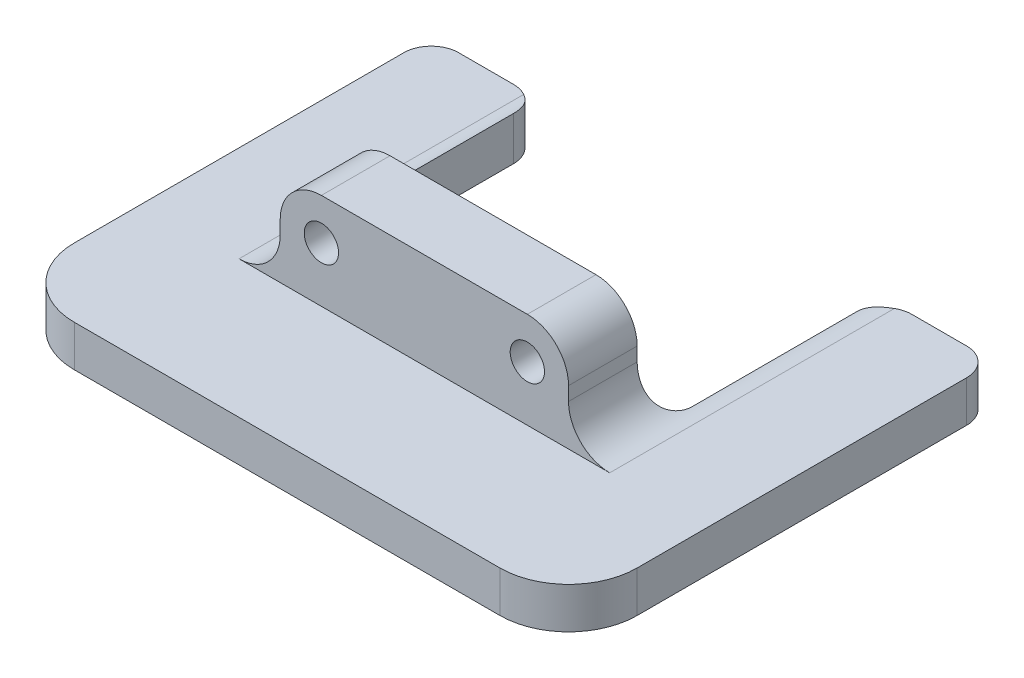
ISO-10303-21;
HEADER;
FILE_DESCRIPTION(('STEP AP214'),'2;1');
FILE_NAME('part.step','',(''),(''),'','','');
FILE_SCHEMA(('AUTOMOTIVE_DESIGN { 1 0 10303 214 1 1 1 1 }'));
ENDSEC;
DATA;
#1=APPLICATION_CONTEXT('core data for automotive mechanical design processes');
#2=APPLICATION_PROTOCOL_DEFINITION('international standard','automotive_design',2000,#1);
#3=PRODUCT_CONTEXT('',#1,'mechanical');
#4=PRODUCT('Part','Part','',(#3));
#5=PRODUCT_RELATED_PRODUCT_CATEGORY('part','',(#4));
#6=PRODUCT_DEFINITION_FORMATION('','',#4);
#7=PRODUCT_DEFINITION_CONTEXT('part definition',#1,'design');
#8=PRODUCT_DEFINITION('design','',#6,#7);
#9=PRODUCT_DEFINITION_SHAPE('','',#8);
#10=(LENGTH_UNIT() NAMED_UNIT(*) SI_UNIT(.MILLI.,.METRE.));
#11=(NAMED_UNIT(*) PLANE_ANGLE_UNIT() SI_UNIT($,.RADIAN.));
#12=(NAMED_UNIT(*) SI_UNIT($,.STERADIAN.) SOLID_ANGLE_UNIT());
#13=UNCERTAINTY_MEASURE_WITH_UNIT(LENGTH_MEASURE(1.E-05),#10,'distance_accuracy_value','');
#14=(GEOMETRIC_REPRESENTATION_CONTEXT(3) GLOBAL_UNCERTAINTY_ASSIGNED_CONTEXT((#13)) GLOBAL_UNIT_ASSIGNED_CONTEXT((#10,
#11,#12)) REPRESENTATION_CONTEXT('',''));
#15=CARTESIAN_POINT('',(0.,0.,0.));
#16=DIRECTION('',(0.,0.,1.));
#17=DIRECTION('',(1.,0.,0.));
#18=AXIS2_PLACEMENT_3D('',#15,#16,#17);
#19=CARTESIAN_POINT('',(15.,0.,0.));
#20=DIRECTION('',(0.,0.,-1.));
#21=DIRECTION('',(-1.,0.,0.));
#22=AXIS2_PLACEMENT_3D('',#19,#20,#21);
#23=PLANE('',#22);
#24=DIRECTION('',(0.,1.,0.));
#25=VECTOR('',#24,1.);
#26=CARTESIAN_POINT('',(18.,-4.,0.));
#27=LINE('',#26,#25);
#28=CARTESIAN_POINT('',(18.,-1.,0.));
#29=VERTEX_POINT('',#28);
#30=CARTESIAN_POINT('',(18.,0.,0.));
#31=VERTEX_POINT('',#30);
#32=EDGE_CURVE('E209',#29,#31,#27,.T.);
#33=ORIENTED_EDGE('',*,*,#32,.F.);
#34=DIRECTION('',(0.,1.,0.));
#35=VECTOR('',#34,1.);
#36=CARTESIAN_POINT('',(18.,-7.,0.));
#37=LINE('',#36,#35);
#38=CARTESIAN_POINT('',(18.,-7.,0.));
#39=VERTEX_POINT('',#38);
#40=EDGE_CURVE('E359',#29,#39,#37,.F.);
#41=ORIENTED_EDGE('',*,*,#40,.T.);
#42=DIRECTION('',(1.,0.,0.));
#43=VECTOR('',#42,1.);
#44=CARTESIAN_POINT('',(-13.,-7.,0.));
#45=LINE('',#44,#43);
#46=CARTESIAN_POINT('',(-3.,-7.,0.));
#47=VERTEX_POINT('',#46);
#48=EDGE_CURVE('E345',#47,#39,#45,.T.);
#49=ORIENTED_EDGE('',*,*,#48,.F.);
#50=DIRECTION('',(0.,1.,0.));
#51=VECTOR('',#50,1.);
#52=CARTESIAN_POINT('',(-3.,-3.82842712474625,0.));
#53=LINE('',#52,#51);
#54=CARTESIAN_POINT('',(-3.,-1.,0.));
#55=VERTEX_POINT('',#54);
#56=EDGE_CURVE('E357',#47,#55,#53,.T.);
#57=ORIENTED_EDGE('',*,*,#56,.T.);
#58=DIRECTION('',(0.,-1.,0.));
#59=VECTOR('',#58,1.);
#60=CARTESIAN_POINT('',(-3.,-4.,0.));
#61=LINE('',#60,#59);
#62=CARTESIAN_POINT('',(-3.,0.,0.));
#63=VERTEX_POINT('',#62);
#64=EDGE_CURVE('E447',#63,#55,#61,.T.);
#65=ORIENTED_EDGE('',*,*,#64,.F.);
#66=CARTESIAN_POINT('',(0.,0.,0.));
#67=DIRECTION('',(0.,0.,1.));
#68=DIRECTION('',(-1.,0.,0.));
#69=AXIS2_PLACEMENT_3D('',#66,#67,#68);
#70=CIRCLE('',#69,3.);
#71=CARTESIAN_POINT('',(0.,3.,0.));
#72=VERTEX_POINT('',#71);
#73=EDGE_CURVE('E445',#72,#63,#70,.T.);
#74=ORIENTED_EDGE('',*,*,#73,.F.);
#75=DIRECTION('',(-1.,0.,0.));
#76=VECTOR('',#75,1.);
#77=CARTESIAN_POINT('',(0.,3.,0.));
#78=LINE('',#77,#76);
#79=CARTESIAN_POINT('',(15.,3.,0.));
#80=VERTEX_POINT('',#79);
#81=EDGE_CURVE('E443',#80,#72,#78,.T.);
#82=ORIENTED_EDGE('',*,*,#81,.F.);
#83=CARTESIAN_POINT('',(15.,0.,0.));
#84=DIRECTION('',(0.,0.,1.));
#85=DIRECTION('',(-1.,0.,0.));
#86=AXIS2_PLACEMENT_3D('',#83,#84,#85);
#87=CIRCLE('',#86,3.);
#88=EDGE_CURVE('E213',#31,#80,#87,.T.);
#89=ORIENTED_EDGE('',*,*,#88,.F.);
#90=EDGE_LOOP('',(#33,#41,#49,#57,#65,#74,#82,#89));
#91=FACE_BOUND('',#90,.T.);
#92=CARTESIAN_POINT('',(0.,0.,0.));
#93=DIRECTION('',(0.,0.,1.));
#94=DIRECTION('',(1.,0.,0.));
#95=AXIS2_PLACEMENT_3D('',#92,#93,#94);
#96=CIRCLE('',#95,1.25);
#97=CARTESIAN_POINT('',(1.25,0.,0.));
#98=VERTEX_POINT('',#97);
#99=EDGE_CURVE('E425',#98,#98,#96,.T.);
#100=ORIENTED_EDGE('',*,*,#99,.T.);
#101=EDGE_LOOP('',(#100));
#102=FACE_BOUND('',#101,.T.);
#103=CARTESIAN_POINT('',(15.,0.,0.));
#104=DIRECTION('',(0.,0.,1.));
#105=DIRECTION('',(1.,0.,0.));
#106=AXIS2_PLACEMENT_3D('',#103,#104,#105);
#107=CIRCLE('',#106,1.25);
#108=CARTESIAN_POINT('',(16.25,0.,0.));
#109=VERTEX_POINT('',#108);
#110=EDGE_CURVE('E416',#109,#109,#107,.T.);
#111=ORIENTED_EDGE('',*,*,#110,.T.);
#112=EDGE_LOOP('',(#111));
#113=FACE_BOUND('',#112,.T.);
#114=ADVANCED_FACE('F33',(#91,#102,#113),#23,.T.);
#115=CARTESIAN_POINT('',(15.,0.,5.));
#116=DIRECTION('',(0.,0.,-1.));
#117=DIRECTION('',(-1.,0.,0.));
#118=AXIS2_PLACEMENT_3D('',#115,#116,#117);
#119=PLANE('',#118);
#120=CARTESIAN_POINT('',(15.,0.,5.));
#121=DIRECTION('',(0.,0.,1.));
#122=DIRECTION('',(-1.,0.,0.));
#123=AXIS2_PLACEMENT_3D('',#120,#121,#122);
#124=CIRCLE('',#123,3.);
#125=CARTESIAN_POINT('',(18.,0.,5.));
#126=VERTEX_POINT('',#125);
#127=CARTESIAN_POINT('',(15.,3.,5.));
#128=VERTEX_POINT('',#127);
#129=EDGE_CURVE('E199',#126,#128,#124,.T.);
#130=ORIENTED_EDGE('',*,*,#129,.T.);
#131=DIRECTION('',(-1.,0.,0.));
#132=VECTOR('',#131,1.);
#133=CARTESIAN_POINT('',(0.,3.,5.));
#134=LINE('',#133,#132);
#135=CARTESIAN_POINT('',(0.,3.,5.));
#136=VERTEX_POINT('',#135);
#137=EDGE_CURVE('E188',#128,#136,#134,.T.);
#138=ORIENTED_EDGE('',*,*,#137,.T.);
#139=CARTESIAN_POINT('',(0.,0.,5.));
#140=DIRECTION('',(0.,0.,1.));
#141=DIRECTION('',(-1.,0.,0.));
#142=AXIS2_PLACEMENT_3D('',#139,#140,#141);
#143=CIRCLE('',#142,3.);
#144=CARTESIAN_POINT('',(-3.,0.,5.));
#145=VERTEX_POINT('',#144);
#146=EDGE_CURVE('E198',#136,#145,#143,.T.);
#147=ORIENTED_EDGE('',*,*,#146,.T.);
#148=DIRECTION('',(0.,-1.,0.));
#149=VECTOR('',#148,1.);
#150=CARTESIAN_POINT('',(-3.,-4.,5.));
#151=LINE('',#150,#149);
#152=CARTESIAN_POINT('',(-3.,-1.,5.));
#153=VERTEX_POINT('',#152);
#154=EDGE_CURVE('E434',#145,#153,#151,.T.);
#155=ORIENTED_EDGE('',*,*,#154,.T.);
#156=CARTESIAN_POINT('',(-6.,-1.,5.));
#157=DIRECTION('',(0.,0.,-1.));
#158=DIRECTION('',(-1.,0.,0.));
#159=AXIS2_PLACEMENT_3D('',#156,#157,#158);
#160=CIRCLE('',#159,3.);
#161=CARTESIAN_POINT('',(-6.,-4.,5.));
#162=VERTEX_POINT('',#161);
#163=EDGE_CURVE('E231',#153,#162,#160,.T.);
#164=ORIENTED_EDGE('',*,*,#163,.T.);
#165=DIRECTION('',(1.,0.,0.));
#166=VECTOR('',#165,1.);
#167=CARTESIAN_POINT('',(-3.,-4.,5.));
#168=LINE('',#167,#166);
#169=CARTESIAN_POINT('',(21.,-4.,5.));
#170=VERTEX_POINT('',#169);
#171=EDGE_CURVE('E437',#162,#170,#168,.T.);
#172=ORIENTED_EDGE('',*,*,#171,.T.);
#173=CARTESIAN_POINT('',(21.,-1.,5.));
#174=DIRECTION('',(0.,0.,-1.));
#175=DIRECTION('',(-1.,0.,0.));
#176=AXIS2_PLACEMENT_3D('',#173,#174,#175);
#177=CIRCLE('',#176,3.);
#178=CARTESIAN_POINT('',(18.,-1.,5.));
#179=VERTEX_POINT('',#178);
#180=EDGE_CURVE('E237',#170,#179,#177,.T.);
#181=ORIENTED_EDGE('',*,*,#180,.T.);
#182=DIRECTION('',(0.,1.,0.));
#183=VECTOR('',#182,1.);
#184=CARTESIAN_POINT('',(18.,-4.,5.));
#185=LINE('',#184,#183);
#186=EDGE_CURVE('E205',#179,#126,#185,.T.);
#187=ORIENTED_EDGE('',*,*,#186,.T.);
#188=EDGE_LOOP('',(#130,#138,#147,#155,#164,#172,#181,#187));
#189=FACE_BOUND('',#188,.T.);
#190=CARTESIAN_POINT('',(0.,0.,5.));
#191=DIRECTION('',(0.,0.,1.));
#192=DIRECTION('',(1.,0.,0.));
#193=AXIS2_PLACEMENT_3D('',#190,#191,#192);
#194=CIRCLE('',#193,1.25);
#195=CARTESIAN_POINT('',(1.25,0.,5.));
#196=VERTEX_POINT('',#195);
#197=EDGE_CURVE('E428',#196,#196,#194,.T.);
#198=ORIENTED_EDGE('',*,*,#197,.F.);
#199=EDGE_LOOP('',(#198));
#200=FACE_BOUND('',#199,.T.);
#201=CARTESIAN_POINT('',(15.,0.,5.));
#202=DIRECTION('',(0.,0.,1.));
#203=DIRECTION('',(1.,0.,0.));
#204=AXIS2_PLACEMENT_3D('',#201,#202,#203);
#205=CIRCLE('',#204,1.25);
#206=CARTESIAN_POINT('',(16.25,0.,5.));
#207=VERTEX_POINT('',#206);
#208=EDGE_CURVE('E422',#207,#207,#205,.T.);
#209=ORIENTED_EDGE('',*,*,#208,.F.);
#210=EDGE_LOOP('',(#209));
#211=FACE_BOUND('',#210,.T.);
#212=ADVANCED_FACE('F202',(#189,#200,#211),#119,.F.);
#213=CARTESIAN_POINT('',(15.,0.,5.));
#214=DIRECTION('',(0.,0.,-1.));
#215=DIRECTION('',(-1.,0.,0.));
#216=AXIS2_PLACEMENT_3D('',#213,#214,#215);
#217=CYLINDRICAL_SURFACE('',#216,3.);
#218=ORIENTED_EDGE('',*,*,#88,.T.);
#219=DIRECTION('',(0.,0.,-1.));
#220=VECTOR('',#219,1.);
#221=CARTESIAN_POINT('',(15.,3.,5.));
#222=LINE('',#221,#220);
#223=EDGE_CURVE('E192',#128,#80,#222,.T.);
#224=ORIENTED_EDGE('',*,*,#223,.F.);
#225=ORIENTED_EDGE('',*,*,#129,.F.);
#226=DIRECTION('',(0.,0.,-1.));
#227=VECTOR('',#226,1.);
#228=CARTESIAN_POINT('',(18.,0.,5.));
#229=LINE('',#228,#227);
#230=EDGE_CURVE('E441',#126,#31,#229,.T.);
#231=ORIENTED_EDGE('',*,*,#230,.T.);
#232=EDGE_LOOP('',(#218,#224,#225,#231));
#233=FACE_BOUND('',#232,.T.);
#234=ADVANCED_FACE('F211',(#233),#217,.T.);
#235=CARTESIAN_POINT('',(0.,3.,5.));
#236=DIRECTION('',(0.,-1.,0.));
#237=DIRECTION('',(0.,0.,-1.));
#238=AXIS2_PLACEMENT_3D('',#235,#236,#237);
#239=PLANE('',#238);
#240=ORIENTED_EDGE('',*,*,#81,.T.);
#241=DIRECTION('',(0.,0.,-1.));
#242=VECTOR('',#241,1.);
#243=CARTESIAN_POINT('',(0.,3.,5.));
#244=LINE('',#243,#242);
#245=EDGE_CURVE('E195',#136,#72,#244,.T.);
#246=ORIENTED_EDGE('',*,*,#245,.F.);
#247=ORIENTED_EDGE('',*,*,#137,.F.);
#248=ORIENTED_EDGE('',*,*,#223,.T.);
#249=EDGE_LOOP('',(#240,#246,#247,#248));
#250=FACE_BOUND('',#249,.T.);
#251=ADVANCED_FACE('F190',(#250),#239,.F.);
#252=CARTESIAN_POINT('',(0.,0.,5.));
#253=DIRECTION('',(0.,0.,-1.));
#254=DIRECTION('',(-1.,0.,0.));
#255=AXIS2_PLACEMENT_3D('',#252,#253,#254);
#256=CYLINDRICAL_SURFACE('',#255,3.);
#257=ORIENTED_EDGE('',*,*,#73,.T.);
#258=DIRECTION('',(0.,0.,-1.));
#259=VECTOR('',#258,1.);
#260=CARTESIAN_POINT('',(-3.,0.,5.));
#261=LINE('',#260,#259);
#262=EDGE_CURVE('E218',#145,#63,#261,.T.);
#263=ORIENTED_EDGE('',*,*,#262,.F.);
#264=ORIENTED_EDGE('',*,*,#146,.F.);
#265=ORIENTED_EDGE('',*,*,#245,.T.);
#266=EDGE_LOOP('',(#257,#263,#264,#265));
#267=FACE_BOUND('',#266,.T.);
#268=ADVANCED_FACE('F473',(#267),#256,.T.);
#269=CARTESIAN_POINT('',(-3.,-4.,5.));
#270=DIRECTION('',(1.,0.,0.));
#271=DIRECTION('',(0.,0.,-1.));
#272=AXIS2_PLACEMENT_3D('',#269,#270,#271);
#273=PLANE('',#272);
#274=ORIENTED_EDGE('',*,*,#64,.T.);
#275=DIRECTION('',(0.,0.,-1.));
#276=VECTOR('',#275,1.);
#277=CARTESIAN_POINT('',(-3.,-1.,5.));
#278=LINE('',#277,#276);
#279=EDGE_CURVE('E224',#55,#153,#278,.F.);
#280=ORIENTED_EDGE('',*,*,#279,.T.);
#281=ORIENTED_EDGE('',*,*,#154,.F.);
#282=ORIENTED_EDGE('',*,*,#262,.T.);
#283=EDGE_LOOP('',(#274,#280,#281,#282));
#284=FACE_BOUND('',#283,.T.);
#285=ADVANCED_FACE('F456',(#284),#273,.F.);
#286=CARTESIAN_POINT('',(18.,-4.,5.));
#287=DIRECTION('',(-1.,0.,0.));
#288=DIRECTION('',(0.,0.,1.));
#289=AXIS2_PLACEMENT_3D('',#286,#287,#288);
#290=PLANE('',#289);
#291=ORIENTED_EDGE('',*,*,#186,.F.);
#292=DIRECTION('',(0.,0.,-1.));
#293=VECTOR('',#292,1.);
#294=CARTESIAN_POINT('',(18.,-1.,5.));
#295=LINE('',#294,#293);
#296=EDGE_CURVE('E226',#179,#29,#295,.T.);
#297=ORIENTED_EDGE('',*,*,#296,.T.);
#298=ORIENTED_EDGE('',*,*,#32,.T.);
#299=ORIENTED_EDGE('',*,*,#230,.F.);
#300=EDGE_LOOP('',(#291,#297,#298,#299));
#301=FACE_BOUND('',#300,.T.);
#302=ADVANCED_FACE('F480',(#301),#290,.F.);
#303=CARTESIAN_POINT('',(0.,0.,5.));
#304=DIRECTION('',(0.,0.,-1.));
#305=DIRECTION('',(-1.,0.,0.));
#306=AXIS2_PLACEMENT_3D('',#303,#304,#305);
#307=CYLINDRICAL_SURFACE('',#306,1.25);
#308=ORIENTED_EDGE('',*,*,#197,.T.);
#309=EDGE_LOOP('',(#308));
#310=FACE_BOUND('',#309,.T.);
#311=ORIENTED_EDGE('',*,*,#99,.F.);
#312=EDGE_LOOP('',(#311));
#313=FACE_BOUND('',#312,.T.);
#314=ADVANCED_FACE('F492',(#310,#313),#307,.F.);
#315=CARTESIAN_POINT('',(15.,0.,5.));
#316=DIRECTION('',(0.,0.,-1.));
#317=DIRECTION('',(-1.,0.,0.));
#318=AXIS2_PLACEMENT_3D('',#315,#316,#317);
#319=CYLINDRICAL_SURFACE('',#318,1.25);
#320=ORIENTED_EDGE('',*,*,#208,.T.);
#321=EDGE_LOOP('',(#320));
#322=FACE_BOUND('',#321,.T.);
#323=ORIENTED_EDGE('',*,*,#110,.F.);
#324=EDGE_LOOP('',(#323));
#325=FACE_BOUND('',#324,.T.);
#326=ADVANCED_FACE('F497',(#322,#325),#319,.F.);
#327=CARTESIAN_POINT('',(0.,-4.,0.));
#328=DIRECTION('',(0.,1.,0.));
#329=DIRECTION('',(0.,0.,1.));
#330=AXIS2_PLACEMENT_3D('',#327,#328,#329);
#331=PLANE('',#330);
#332=DIRECTION('',(0.,0.,1.));
#333=VECTOR('',#332,1.);
#334=CARTESIAN_POINT('',(28.,-4.,0.));
#335=LINE('',#334,#333);
#336=CARTESIAN_POINT('',(28.,-4.,-14.));
#337=VERTEX_POINT('',#336);
#338=CARTESIAN_POINT('',(28.,-4.,10.));
#339=VERTEX_POINT('',#338);
#340=EDGE_CURVE('E418',#337,#339,#335,.T.);
#341=ORIENTED_EDGE('',*,*,#340,.F.);
#342=CARTESIAN_POINT('',(26.,-4.,-14.));
#343=DIRECTION('',(0.,1.,0.));
#344=DIRECTION('',(0.,0.,1.));
#345=AXIS2_PLACEMENT_3D('',#342,#343,#344);
#346=CIRCLE('',#345,2.);
#347=CARTESIAN_POINT('',(26.,-4.,-16.));
#348=VERTEX_POINT('',#347);
#349=EDGE_CURVE('E268',#337,#348,#346,.T.);
#350=ORIENTED_EDGE('',*,*,#349,.T.);
#351=DIRECTION('',(-1.,0.,0.));
#352=VECTOR('',#351,1.);
#353=CARTESIAN_POINT('',(28.,-4.,-16.));
#354=LINE('',#353,#352);
#355=CARTESIAN_POINT('',(22.,-4.,-16.));
#356=VERTEX_POINT('',#355);
#357=EDGE_CURVE('E355',#348,#356,#354,.T.);
#358=ORIENTED_EDGE('',*,*,#357,.T.);
#359=CARTESIAN_POINT('',(22.,-4.,-14.));
#360=DIRECTION('',(0.,1.,0.));
#361=DIRECTION('',(0.,0.,1.));
#362=AXIS2_PLACEMENT_3D('',#359,#360,#361);
#363=CIRCLE('',#362,2.);
#364=CARTESIAN_POINT('',(21.,-4.,-15.7320508075689));
#365=VERTEX_POINT('',#364);
#366=EDGE_CURVE('E266',#356,#365,#363,.T.);
#367=ORIENTED_EDGE('',*,*,#366,.T.);
#368=DIRECTION('',(0.,0.,-1.));
#369=VECTOR('',#368,1.);
#370=CARTESIAN_POINT('',(21.,-4.,0.));
#371=LINE('',#370,#369);
#372=EDGE_CURVE('E214',#365,#170,#371,.F.);
#373=ORIENTED_EDGE('',*,*,#372,.T.);
#374=ORIENTED_EDGE('',*,*,#171,.F.);
#375=DIRECTION('',(0.,0.,-1.));
#376=VECTOR('',#375,1.);
#377=CARTESIAN_POINT('',(-6.,-4.,0.));
#378=LINE('',#377,#376);
#379=CARTESIAN_POINT('',(-6.,-4.,-15.7320508075689));
#380=VERTEX_POINT('',#379);
#381=EDGE_CURVE('E216',#162,#380,#378,.T.);
#382=ORIENTED_EDGE('',*,*,#381,.T.);
#383=CARTESIAN_POINT('',(-7.,-4.,-14.));
#384=DIRECTION('',(0.,1.,0.));
#385=DIRECTION('',(0.,0.,1.));
#386=AXIS2_PLACEMENT_3D('',#383,#384,#385);
#387=CIRCLE('',#386,2.);
#388=CARTESIAN_POINT('',(-7.,-4.,-16.));
#389=VERTEX_POINT('',#388);
#390=EDGE_CURVE('E264',#380,#389,#387,.T.);
#391=ORIENTED_EDGE('',*,*,#390,.T.);
#392=DIRECTION('',(-1.,0.,0.));
#393=VECTOR('',#392,1.);
#394=CARTESIAN_POINT('',(-13.,-4.,-16.));
#395=LINE('',#394,#393);
#396=CARTESIAN_POINT('',(-11.,-4.,-16.));
#397=VERTEX_POINT('',#396);
#398=EDGE_CURVE('E399',#389,#397,#395,.T.);
#399=ORIENTED_EDGE('',*,*,#398,.T.);
#400=CARTESIAN_POINT('',(-11.,-4.,-14.));
#401=DIRECTION('',(0.,1.,0.));
#402=DIRECTION('',(0.,0.,1.));
#403=AXIS2_PLACEMENT_3D('',#400,#401,#402);
#404=CIRCLE('',#403,2.);
#405=CARTESIAN_POINT('',(-13.,-4.,-14.));
#406=VERTEX_POINT('',#405);
#407=EDGE_CURVE('E262',#397,#406,#404,.T.);
#408=ORIENTED_EDGE('',*,*,#407,.T.);
#409=DIRECTION('',(0.,0.,-1.));
#410=VECTOR('',#409,1.);
#411=CARTESIAN_POINT('',(-13.,-4.,0.));
#412=LINE('',#411,#410);
#413=CARTESIAN_POINT('',(-13.,-4.,10.));
#414=VERTEX_POINT('',#413);
#415=EDGE_CURVE('E389',#414,#406,#412,.T.);
#416=ORIENTED_EDGE('',*,*,#415,.F.);
#417=CARTESIAN_POINT('',(-8.,-4.,10.));
#418=DIRECTION('',(0.,1.,0.));
#419=DIRECTION('',(0.,0.,1.));
#420=AXIS2_PLACEMENT_3D('',#417,#418,#419);
#421=CIRCLE('',#420,5.);
#422=CARTESIAN_POINT('',(-8.,-4.,15.));
#423=VERTEX_POINT('',#422);
#424=EDGE_CURVE('E245',#414,#423,#421,.T.);
#425=ORIENTED_EDGE('',*,*,#424,.T.);
#426=DIRECTION('',(-1.,0.,0.));
#427=VECTOR('',#426,1.);
#428=CARTESIAN_POINT('',(-13.,-4.,15.));
#429=LINE('',#428,#427);
#430=CARTESIAN_POINT('',(23.,-4.,15.));
#431=VERTEX_POINT('',#430);
#432=EDGE_CURVE('E394',#431,#423,#429,.T.);
#433=ORIENTED_EDGE('',*,*,#432,.F.);
#434=CARTESIAN_POINT('',(23.,-4.,10.));
#435=DIRECTION('',(0.,1.,0.));
#436=DIRECTION('',(0.,0.,1.));
#437=AXIS2_PLACEMENT_3D('',#434,#435,#436);
#438=CIRCLE('',#437,5.);
#439=EDGE_CURVE('E242',#431,#339,#438,.T.);
#440=ORIENTED_EDGE('',*,*,#439,.T.);
#441=EDGE_LOOP('',(#341,#350,#358,#367,#373,#374,#382,#391,#399,#408,#416,#425,#433,#440));
#442=FACE_BOUND('',#441,.T.);
#443=ADVANCED_FACE('F403',(#442),#331,.T.);
#444=CARTESIAN_POINT('',(-13.,-7.,0.));
#445=DIRECTION('',(1.,0.,0.));
#446=DIRECTION('',(0.,0.,-1.));
#447=AXIS2_PLACEMENT_3D('',#444,#445,#446);
#448=PLANE('',#447);
#449=ORIENTED_EDGE('',*,*,#415,.T.);
#450=DIRECTION('',(0.,1.,0.));
#451=VECTOR('',#450,1.);
#452=CARTESIAN_POINT('',(-13.,-7.,-14.));
#453=LINE('',#452,#451);
#454=CARTESIAN_POINT('',(-13.,-7.,-14.));
#455=VERTEX_POINT('',#454);
#456=EDGE_CURVE('E318',#406,#455,#453,.F.);
#457=ORIENTED_EDGE('',*,*,#456,.T.);
#458=DIRECTION('',(0.,0.,-1.));
#459=VECTOR('',#458,1.);
#460=CARTESIAN_POINT('',(-13.,-7.,0.));
#461=LINE('',#460,#459);
#462=CARTESIAN_POINT('',(-13.,-7.,10.));
#463=VERTEX_POINT('',#462);
#464=EDGE_CURVE('E386',#463,#455,#461,.T.);
#465=ORIENTED_EDGE('',*,*,#464,.F.);
#466=DIRECTION('',(0.,1.,0.));
#467=VECTOR('',#466,1.);
#468=CARTESIAN_POINT('',(-13.,-7.,10.));
#469=LINE('',#468,#467);
#470=EDGE_CURVE('E239',#463,#414,#469,.T.);
#471=ORIENTED_EDGE('',*,*,#470,.T.);
#472=EDGE_LOOP('',(#449,#457,#465,#471));
#473=FACE_BOUND('',#472,.T.);
#474=ADVANCED_FACE('F385',(#473),#448,.F.);
#475=CARTESIAN_POINT('',(28.,-7.,0.));
#476=DIRECTION('',(-1.,0.,0.));
#477=DIRECTION('',(0.,0.,1.));
#478=AXIS2_PLACEMENT_3D('',#475,#476,#477);
#479=PLANE('',#478);
#480=DIRECTION('',(0.,0.,1.));
#481=VECTOR('',#480,1.);
#482=CARTESIAN_POINT('',(28.,-7.,0.));
#483=LINE('',#482,#481);
#484=CARTESIAN_POINT('',(28.,-7.,-14.));
#485=VERTEX_POINT('',#484);
#486=CARTESIAN_POINT('',(28.,-7.,10.));
#487=VERTEX_POINT('',#486);
#488=EDGE_CURVE('E412',#485,#487,#483,.T.);
#489=ORIENTED_EDGE('',*,*,#488,.F.);
#490=DIRECTION('',(0.,1.,0.));
#491=VECTOR('',#490,1.);
#492=CARTESIAN_POINT('',(28.,-4.,-14.));
#493=LINE('',#492,#491);
#494=EDGE_CURVE('E259',#485,#337,#493,.T.);
#495=ORIENTED_EDGE('',*,*,#494,.T.);
#496=ORIENTED_EDGE('',*,*,#340,.T.);
#497=DIRECTION('',(0.,1.,0.));
#498=VECTOR('',#497,1.);
#499=CARTESIAN_POINT('',(28.,-7.,10.));
#500=LINE('',#499,#498);
#501=EDGE_CURVE('E256',#339,#487,#500,.F.);
#502=ORIENTED_EDGE('',*,*,#501,.T.);
#503=EDGE_LOOP('',(#489,#495,#496,#502));
#504=FACE_BOUND('',#503,.T.);
#505=ADVANCED_FACE('F515',(#504),#479,.F.);
#506=CARTESIAN_POINT('',(-13.,-7.,15.));
#507=DIRECTION('',(0.,0.,-1.));
#508=DIRECTION('',(-1.,0.,0.));
#509=AXIS2_PLACEMENT_3D('',#506,#507,#508);
#510=PLANE('',#509);
#511=ORIENTED_EDGE('',*,*,#432,.T.);
#512=DIRECTION('',(0.,1.,0.));
#513=VECTOR('',#512,1.);
#514=CARTESIAN_POINT('',(-8.,-7.,15.));
#515=LINE('',#514,#513);
#516=CARTESIAN_POINT('',(-8.,-7.,15.));
#517=VERTEX_POINT('',#516);
#518=EDGE_CURVE('E250',#423,#517,#515,.F.);
#519=ORIENTED_EDGE('',*,*,#518,.T.);
#520=DIRECTION('',(-1.,0.,0.));
#521=VECTOR('',#520,1.);
#522=CARTESIAN_POINT('',(-13.,-7.,15.));
#523=LINE('',#522,#521);
#524=CARTESIAN_POINT('',(23.,-7.,15.));
#525=VERTEX_POINT('',#524);
#526=EDGE_CURVE('E414',#525,#517,#523,.T.);
#527=ORIENTED_EDGE('',*,*,#526,.F.);
#528=DIRECTION('',(0.,1.,0.));
#529=VECTOR('',#528,1.);
#530=CARTESIAN_POINT('',(23.,-7.,15.));
#531=LINE('',#530,#529);
#532=EDGE_CURVE('E247',#525,#431,#531,.T.);
#533=ORIENTED_EDGE('',*,*,#532,.T.);
#534=EDGE_LOOP('',(#511,#519,#527,#533));
#535=FACE_BOUND('',#534,.T.);
#536=ADVANCED_FACE('F523',(#535),#510,.F.);
#537=CARTESIAN_POINT('',(0.,-7.,0.));
#538=DIRECTION('',(0.,1.,0.));
#539=DIRECTION('',(0.,0.,1.));
#540=AXIS2_PLACEMENT_3D('',#537,#538,#539);
#541=PLANE('',#540);
#542=DIRECTION('',(1.,0.,0.));
#543=VECTOR('',#542,1.);
#544=CARTESIAN_POINT('',(28.,-7.,-16.));
#545=LINE('',#544,#543);
#546=CARTESIAN_POINT('',(22.,-7.,-16.));
#547=VERTEX_POINT('',#546);
#548=CARTESIAN_POINT('',(26.,-7.,-16.));
#549=VERTEX_POINT('',#548);
#550=EDGE_CURVE('E354',#547,#549,#545,.T.);
#551=ORIENTED_EDGE('',*,*,#550,.T.);
#552=CARTESIAN_POINT('',(26.,-7.,-14.));
#553=DIRECTION('',(0.,1.,0.));
#554=DIRECTION('',(0.,0.,1.));
#555=AXIS2_PLACEMENT_3D('',#552,#553,#554);
#556=CIRCLE('',#555,2.);
#557=EDGE_CURVE('E281',#549,#485,#556,.F.);
#558=ORIENTED_EDGE('',*,*,#557,.T.);
#559=ORIENTED_EDGE('',*,*,#488,.T.);
#560=CARTESIAN_POINT('',(23.,-7.,10.));
#561=DIRECTION('',(0.,1.,0.));
#562=DIRECTION('',(0.,0.,1.));
#563=AXIS2_PLACEMENT_3D('',#560,#561,#562);
#564=CIRCLE('',#563,5.);
#565=EDGE_CURVE('E252',#487,#525,#564,.F.);
#566=ORIENTED_EDGE('',*,*,#565,.T.);
#567=ORIENTED_EDGE('',*,*,#526,.T.);
#568=CARTESIAN_POINT('',(-8.,-7.,10.));
#569=DIRECTION('',(0.,1.,0.));
#570=DIRECTION('',(0.,0.,1.));
#571=AXIS2_PLACEMENT_3D('',#568,#569,#570);
#572=CIRCLE('',#571,5.);
#573=EDGE_CURVE('E254',#517,#463,#572,.F.);
#574=ORIENTED_EDGE('',*,*,#573,.T.);
#575=ORIENTED_EDGE('',*,*,#464,.T.);
#576=CARTESIAN_POINT('',(-11.,-7.,-14.));
#577=DIRECTION('',(0.,1.,0.));
#578=DIRECTION('',(0.,0.,1.));
#579=AXIS2_PLACEMENT_3D('',#576,#577,#578);
#580=CIRCLE('',#579,2.);
#581=CARTESIAN_POINT('',(-11.,-7.,-16.));
#582=VERTEX_POINT('',#581);
#583=EDGE_CURVE('E275',#455,#582,#580,.F.);
#584=ORIENTED_EDGE('',*,*,#583,.T.);
#585=DIRECTION('',(1.,0.,0.));
#586=VECTOR('',#585,1.);
#587=CARTESIAN_POINT('',(-13.,-7.,-16.));
#588=LINE('',#587,#586);
#589=CARTESIAN_POINT('',(-7.,-7.,-16.));
#590=VERTEX_POINT('',#589);
#591=EDGE_CURVE('E400',#582,#590,#588,.T.);
#592=ORIENTED_EDGE('',*,*,#591,.T.);
#593=CARTESIAN_POINT('',(-7.,-7.,-14.));
#594=DIRECTION('',(0.,1.,0.));
#595=DIRECTION('',(0.,0.,1.));
#596=AXIS2_PLACEMENT_3D('',#593,#594,#595);
#597=CIRCLE('',#596,2.);
#598=CARTESIAN_POINT('',(-5.,-7.,-14.));
#599=VERTEX_POINT('',#598);
#600=EDGE_CURVE('E277',#590,#599,#597,.F.);
#601=ORIENTED_EDGE('',*,*,#600,.T.);
#602=DIRECTION('',(0.,0.,1.));
#603=VECTOR('',#602,1.);
#604=CARTESIAN_POINT('',(-5.,-7.,0.));
#605=LINE('',#604,#603);
#606=CARTESIAN_POINT('',(-5.,-7.,-2.));
#607=VERTEX_POINT('',#606);
#608=EDGE_CURVE('E404',#599,#607,#605,.T.);
#609=ORIENTED_EDGE('',*,*,#608,.T.);
#610=CARTESIAN_POINT('',(-3.,-7.,-2.));
#611=DIRECTION('',(0.,1.,0.));
#612=DIRECTION('',(0.,0.,1.));
#613=AXIS2_PLACEMENT_3D('',#610,#611,#612);
#614=CIRCLE('',#613,2.);
#615=EDGE_CURVE('E11',#607,#47,#614,.T.);
#616=ORIENTED_EDGE('',*,*,#615,.T.);
#617=ORIENTED_EDGE('',*,*,#48,.T.);
#618=CARTESIAN_POINT('',(18.,-7.,-2.));
#619=DIRECTION('',(0.,1.,0.));
#620=DIRECTION('',(0.,0.,1.));
#621=AXIS2_PLACEMENT_3D('',#618,#619,#620);
#622=CIRCLE('',#621,2.);
#623=CARTESIAN_POINT('',(20.,-7.,-2.));
#624=VERTEX_POINT('',#623);
#625=EDGE_CURVE('E317',#39,#624,#622,.T.);
#626=ORIENTED_EDGE('',*,*,#625,.T.);
#627=DIRECTION('',(0.,0.,-1.));
#628=VECTOR('',#627,1.);
#629=CARTESIAN_POINT('',(20.,-7.,0.));
#630=LINE('',#629,#628);
#631=CARTESIAN_POINT('',(20.,-7.,-14.));
#632=VERTEX_POINT('',#631);
#633=EDGE_CURVE('E342',#624,#632,#630,.T.);
#634=ORIENTED_EDGE('',*,*,#633,.T.);
#635=CARTESIAN_POINT('',(22.,-7.,-14.));
#636=DIRECTION('',(0.,1.,0.));
#637=DIRECTION('',(0.,0.,1.));
#638=AXIS2_PLACEMENT_3D('',#635,#636,#637);
#639=CIRCLE('',#638,2.);
#640=EDGE_CURVE('E279',#632,#547,#639,.F.);
#641=ORIENTED_EDGE('',*,*,#640,.T.);
#642=EDGE_LOOP('',(#551,#558,#559,#566,#567,#574,#575,#584,#592,#601,#609,#616,#617,#626,#634,#641));
#643=FACE_BOUND('',#642,.T.);
#644=ADVANCED_FACE('F341',(#643),#541,.F.);
#645=CARTESIAN_POINT('',(-13.,-24.8885438199983,-16.));
#646=DIRECTION('',(0.,0.,-1.));
#647=DIRECTION('',(-1.,0.,0.));
#648=AXIS2_PLACEMENT_3D('',#645,#646,#647);
#649=PLANE('',#648);
#650=ORIENTED_EDGE('',*,*,#398,.F.);
#651=DIRECTION('',(0.,1.,0.));
#652=VECTOR('',#651,1.);
#653=CARTESIAN_POINT('',(-7.,-24.8885438199983,-16.));
#654=LINE('',#653,#652);
#655=EDGE_CURVE('E374',#389,#590,#654,.F.);
#656=ORIENTED_EDGE('',*,*,#655,.T.);
#657=ORIENTED_EDGE('',*,*,#591,.F.);
#658=DIRECTION('',(0.,1.,0.));
#659=VECTOR('',#658,1.);
#660=CARTESIAN_POINT('',(-11.,-4.,-16.));
#661=LINE('',#660,#659);
#662=EDGE_CURVE('E372',#582,#397,#661,.T.);
#663=ORIENTED_EDGE('',*,*,#662,.T.);
#664=EDGE_LOOP('',(#650,#656,#657,#663));
#665=FACE_BOUND('',#664,.T.);
#666=ADVANCED_FACE('F398',(#665),#649,.T.);
#667=CARTESIAN_POINT('',(-5.,-24.8885438199983,0.));
#668=DIRECTION('',(1.,0.,0.));
#669=DIRECTION('',(0.,0.,-1.));
#670=AXIS2_PLACEMENT_3D('',#667,#668,#669);
#671=PLANE('',#670);
#672=DIRECTION('',(0.,0.,-1.));
#673=VECTOR('',#672,1.);
#674=CARTESIAN_POINT('',(-5.,-3.82842712474625,-16.));
#675=LINE('',#674,#673);
#676=CARTESIAN_POINT('',(-5.,-3.82842712474625,-14.));
#677=VERTEX_POINT('',#676);
#678=CARTESIAN_POINT('',(-5.,-3.82842712474625,-2.));
#679=VERTEX_POINT('',#678);
#680=EDGE_CURVE('E229',#677,#679,#675,.F.);
#681=ORIENTED_EDGE('',*,*,#680,.T.);
#682=DIRECTION('',(0.,1.,0.));
#683=VECTOR('',#682,1.);
#684=CARTESIAN_POINT('',(-5.,-7.,-2.));
#685=LINE('',#684,#683);
#686=EDGE_CURVE('E365',#679,#607,#685,.F.);
#687=ORIENTED_EDGE('',*,*,#686,.T.);
#688=ORIENTED_EDGE('',*,*,#608,.F.);
#689=DIRECTION('',(0.,1.,0.));
#690=VECTOR('',#689,1.);
#691=CARTESIAN_POINT('',(-5.,-24.8885438199983,-14.));
#692=LINE('',#691,#690);
#693=EDGE_CURVE('E363',#599,#677,#692,.T.);
#694=ORIENTED_EDGE('',*,*,#693,.T.);
#695=EDGE_LOOP('',(#681,#687,#688,#694));
#696=FACE_BOUND('',#695,.T.);
#697=ADVANCED_FACE('F467',(#696),#671,.T.);
#698=CARTESIAN_POINT('',(20.,-24.8885438199983,0.));
#699=DIRECTION('',(-1.,0.,0.));
#700=DIRECTION('',(0.,0.,1.));
#701=AXIS2_PLACEMENT_3D('',#698,#699,#700);
#702=PLANE('',#701);
#703=DIRECTION('',(0.,0.,-1.));
#704=VECTOR('',#703,1.);
#705=CARTESIAN_POINT('',(20.,-3.82842712474624,0.));
#706=LINE('',#705,#704);
#707=CARTESIAN_POINT('',(20.,-3.82842712474624,-2.));
#708=VERTEX_POINT('',#707);
#709=CARTESIAN_POINT('',(20.,-3.82842712474624,-14.));
#710=VERTEX_POINT('',#709);
#711=EDGE_CURVE('E234',#708,#710,#706,.T.);
#712=ORIENTED_EDGE('',*,*,#711,.T.);
#713=DIRECTION('',(0.,1.,0.));
#714=VECTOR('',#713,1.);
#715=CARTESIAN_POINT('',(20.,-24.8885438199983,-14.));
#716=LINE('',#715,#714);
#717=EDGE_CURVE('E353',#710,#632,#716,.F.);
#718=ORIENTED_EDGE('',*,*,#717,.T.);
#719=ORIENTED_EDGE('',*,*,#633,.F.);
#720=DIRECTION('',(0.,1.,0.));
#721=VECTOR('',#720,1.);
#722=CARTESIAN_POINT('',(20.,-3.82842712474624,-2.));
#723=LINE('',#722,#721);
#724=EDGE_CURVE('E291',#624,#708,#723,.T.);
#725=ORIENTED_EDGE('',*,*,#724,.T.);
#726=EDGE_LOOP('',(#712,#718,#719,#725));
#727=FACE_BOUND('',#726,.T.);
#728=ADVANCED_FACE('F350',(#727),#702,.T.);
#729=CARTESIAN_POINT('',(28.,-24.8885438199983,-16.));
#730=DIRECTION('',(0.,0.,-1.));
#731=DIRECTION('',(-1.,0.,0.));
#732=AXIS2_PLACEMENT_3D('',#729,#730,#731);
#733=PLANE('',#732);
#734=ORIENTED_EDGE('',*,*,#357,.F.);
#735=DIRECTION('',(0.,1.,0.));
#736=VECTOR('',#735,1.);
#737=CARTESIAN_POINT('',(26.,-7.,-16.));
#738=LINE('',#737,#736);
#739=EDGE_CURVE('E273',#348,#549,#738,.F.);
#740=ORIENTED_EDGE('',*,*,#739,.T.);
#741=ORIENTED_EDGE('',*,*,#550,.F.);
#742=DIRECTION('',(0.,1.,0.));
#743=VECTOR('',#742,1.);
#744=CARTESIAN_POINT('',(22.,-24.8885438199983,-16.));
#745=LINE('',#744,#743);
#746=EDGE_CURVE('E270',#547,#356,#745,.T.);
#747=ORIENTED_EDGE('',*,*,#746,.T.);
#748=EDGE_LOOP('',(#734,#740,#741,#747));
#749=FACE_BOUND('',#748,.T.);
#750=ADVANCED_FACE('F507',(#749),#733,.T.);
#751=CARTESIAN_POINT('',(-6.,-1.,0.));
#752=DIRECTION('',(0.,0.,-1.));
#753=DIRECTION('',(-1.,0.,0.));
#754=AXIS2_PLACEMENT_3D('',#751,#752,#753);
#755=CYLINDRICAL_SURFACE('',#754,3.);
#756=ORIENTED_EDGE('',*,*,#680,.F.);
#757=CARTESIAN_POINT('',(-5.,-3.82842712474625,-14.));
#758=CARTESIAN_POINT('',(-4.99999265806744,-3.82841182400506,-14.0550781443512));
#759=CARTESIAN_POINT('',(-5.00227500591609,-3.82923117584639,-14.1101500412768));
#760=CARTESIAN_POINT('',(-5.01136111584483,-3.83242569745194,-14.2198545591851));
#761=CARTESIAN_POINT('',(-5.01816321990644,-3.83480029668771,-14.2744873338191));
#762=CARTESIAN_POINT('',(-5.0361980138943,-3.84098069178117,-14.3827301025215));
#763=CARTESIAN_POINT('',(-5.04741445783428,-3.84478123739696,-14.4363430996268));
#764=CARTESIAN_POINT('',(-5.07416707223557,-3.85359959007776,-14.5423653209714));
#765=CARTESIAN_POINT('',(-5.08970350307169,-3.85861747051181,-14.5947744724462));
#766=CARTESIAN_POINT('',(-5.14257832660738,-3.87510102498306,-14.7495615693944));
#767=CARTESIAN_POINT('',(-5.18621778846857,-3.88801038075264,-14.8497100001151));
#768=CARTESIAN_POINT('',(-5.28914341782373,-3.91504713179848,-15.0415650897109));
#769=CARTESIAN_POINT('',(-5.34845525174275,-3.9291764992807,-15.1332575650193));
#770=CARTESIAN_POINT('',(-5.48385826583204,-3.95610303069603,-15.309236919));
#771=CARTESIAN_POINT('',(-5.5604977473639,-3.968829884862,-15.3931142625969));
#772=CARTESIAN_POINT('',(-5.72713103404349,-3.98873065956576,-15.5467909753149));
#773=CARTESIAN_POINT('',(-5.81708101677128,-3.9959223392079,-15.6166348321069));
#774=CARTESIAN_POINT('',(-5.9410464530328,-3.99956180739713,-15.6970011035699));
#775=CARTESIAN_POINT('',(-5.97030509276333,-4.00000476420336,-15.7149153152082));
#776=CARTESIAN_POINT('',(-6.,-4.,-15.7320508075689));
#777=B_SPLINE_CURVE_WITH_KNOTS('',3,(#757,#758,#759,#760,#761,#762,#763,#764,#765,#766,#767,
#768,#769,#770,#771,#772,#773,#774,#775,#776),.UNSPECIFIED.,.F.,.F.,(4,2,2,2,2,2,2,2,2,4),(0.,
0.165170648534212,0.330280739618907,0.49478877858866,0.659306734958521,0.987707896978204,
1.31665024663155,1.65799423936293,1.99823844213363,2.1011137942272),.UNSPECIFIED.);
#778=EDGE_CURVE('E55',#677,#380,#777,.T.);
#779=ORIENTED_EDGE('',*,*,#778,.T.);
#780=ORIENTED_EDGE('',*,*,#381,.F.);
#781=ORIENTED_EDGE('',*,*,#163,.F.);
#782=ORIENTED_EDGE('',*,*,#279,.F.);
#783=CARTESIAN_POINT('',(-3.,-1.,0.));
#784=CARTESIAN_POINT('',(-2.99999081844046,-1.08468057991087,-4.08070034306521E-05));
#785=CARTESIAN_POINT('',(-3.00358502848274,-1.16935984299454,-1.27835970598177E-06));
#786=CARTESIAN_POINT('',(-3.01791476964296,-1.338119549342,-5.65012641626756E-05));
#787=CARTESIAN_POINT('',(-3.02865092870103,-1.42219993929414,-0.000151264620500521));
#788=CARTESIAN_POINT('',(-3.05729332648929,-1.58970174068187,-0.000772162532402998));
#789=CARTESIAN_POINT('',(-3.07524643651899,-1.67311513617932,-0.00130114101613216));
#790=CARTESIAN_POINT('',(-3.11818494576128,-1.83809659216666,-0.00337855864146647));
#791=CARTESIAN_POINT('',(-3.14316995402086,-1.91966475497379,-0.00492694111359556));
#792=CARTESIAN_POINT('',(-3.19972713561523,-2.07963192891732,-0.0097974506784253));
#793=CARTESIAN_POINT('',(-3.23123972487629,-2.15805243336397,-0.0131039303784691));
#794=CARTESIAN_POINT('',(-3.30069623124199,-2.31182116914053,-0.0224233251806503));
#795=CARTESIAN_POINT('',(-3.33863919680813,-2.38716985298129,-0.0284358400733516));
#796=CARTESIAN_POINT('',(-3.42039578430527,-2.53383781854975,-0.0442411613398568));
#797=CARTESIAN_POINT('',(-3.46418631950306,-2.60517145311518,-0.0540193727209806));
#798=CARTESIAN_POINT('',(-3.55709797012513,-2.74331923223528,-0.0785553331548114));
#799=CARTESIAN_POINT('',(-3.60621609811189,-2.81013587590906,-0.09331030119415));
#800=CARTESIAN_POINT('',(-3.72644449064535,-2.96036847402638,-0.135170718817197));
#801=CARTESIAN_POINT('',(-3.79935240550658,-3.04170009515619,-0.164769986464137));
#802=CARTESIAN_POINT('',(-3.94991970666177,-3.19283794734629,-0.238002315579784));
#803=CARTESIAN_POINT('',(-4.02757553149147,-3.26265267545136,-0.281624960041121));
#804=CARTESIAN_POINT('',(-4.18356921035068,-3.38972050895516,-0.385082520904076));
#805=CARTESIAN_POINT('',(-4.26190821091273,-3.44688878069924,-0.445021245125527));
#806=CARTESIAN_POINT('',(-4.41315020340085,-3.54758450888201,-0.581081902238124));
#807=CARTESIAN_POINT('',(-4.48605436171465,-3.59111489864708,-0.657200349166925));
#808=CARTESIAN_POINT('',(-4.61396154827047,-3.66151793977056,-0.814949901252832));
#809=CARTESIAN_POINT('',(-4.67004207472746,-3.68966458158605,-0.895149014407888));
#810=CARTESIAN_POINT('',(-4.77068058062243,-3.73713000522794,-1.06489323914979));
#811=CARTESIAN_POINT('',(-4.81523378555883,-3.75644513166184,-1.15444220186677));
#812=CARTESIAN_POINT('',(-4.89062757014722,-3.7876443203711,-1.34003742436189));
#813=CARTESIAN_POINT('',(-4.92150208152069,-3.7995468007756,-1.43606691796425));
#814=CARTESIAN_POINT('',(-4.96845166141496,-3.81718754983315,-1.63212841162731));
#815=CARTESIAN_POINT('',(-4.98454876903728,-3.82293500027123,-1.73215421828837));
#816=CARTESIAN_POINT('',(-4.99533244902172,-3.82677253231539,-1.86059558286367));
#817=CARTESIAN_POINT('',(-4.99708359824896,-3.82739424707241,-1.88846715741564));
#818=CARTESIAN_POINT('',(-4.99941577902837,-3.82822112635189,-1.94422253892553));
#819=CARTESIAN_POINT('',(-4.99999860329149,-3.82842692906555,-1.97210626137568));
#820=CARTESIAN_POINT('',(-5.,-3.82842712474619,-2.));
#821=B_SPLINE_CURVE_WITH_KNOTS('',3,(#783,#784,#785,#786,#787,#788,#789,#790,#791,#792,#793,
#794,#795,#796,#797,#798,#799,#800,#801,#802,#803,#804,#805,#806,#807,#808,#809,#810,#811,#812,
#813,#814,#815,#816,#817,#818,#819,#820),.UNSPECIFIED.,.F.,.F.,(4,2,2,2,2,2,2,2,2,2,2,2,2,2,2,2,
2,2,4),(0.,0.253963590261567,0.507949512664211,0.763612336281237,1.0192609485991,
1.27267141765619,1.52604442084744,1.77844513285816,2.03070503628705,2.36876911822807,
2.7065826535299,3.04659783092807,3.38653982531267,3.69056771212811,3.99472132339932,
4.29811616010172,4.60105777345976,4.68484074777505,4.76849506441024),.UNSPECIFIED.);
#822=EDGE_CURVE('E41',#55,#679,#821,.T.);
#823=ORIENTED_EDGE('',*,*,#822,.T.);
#824=EDGE_LOOP('',(#756,#779,#780,#781,#782,#823));
#825=FACE_BOUND('',#824,.T.);
#826=ADVANCED_FACE('F303',(#825),#755,.F.);
#827=CARTESIAN_POINT('',(21.,-1.,5.));
#828=DIRECTION('',(0.,0.,-1.));
#829=DIRECTION('',(-1.,0.,0.));
#830=AXIS2_PLACEMENT_3D('',#827,#828,#829);
#831=CYLINDRICAL_SURFACE('',#830,3.);
#832=ORIENTED_EDGE('',*,*,#372,.F.);
#833=CARTESIAN_POINT('',(21.,-4.,-15.7320508075689));
#834=CARTESIAN_POINT('',(20.9523414448146,-4.00000326087516,-15.7045380746525));
#835=CARTESIAN_POINT('',(20.9058562742383,-3.99886399104074,-15.6750731064375));
#836=CARTESIAN_POINT('',(20.8155535615913,-3.99466481328935,-15.6124832604689));
#837=CARTESIAN_POINT('',(20.7717342727433,-3.99160617820372,-15.579360820162));
#838=CARTESIAN_POINT('',(20.6449980847357,-3.98012484554497,-15.4750903721172));
#839=CARTESIAN_POINT('',(20.5664219047201,-3.96939095787028,-15.3988182442151));
#840=CARTESIAN_POINT('',(20.4231201340441,-3.94491159144625,-15.2350273871356));
#841=CARTESIAN_POINT('',(20.3583676496828,-3.93117206756554,-15.1475310355719));
#842=CARTESIAN_POINT('',(20.2437891234135,-3.90372590330973,-14.963075842983));
#843=CARTESIAN_POINT('',(20.1939822789344,-3.89001932747095,-14.8661050422063));
#844=CARTESIAN_POINT('',(20.1088900707715,-3.86495782183999,-14.6607443625401));
#845=CARTESIAN_POINT('',(20.0743140953613,-3.85372801866045,-14.5520439448012));
#846=CARTESIAN_POINT('',(20.0241747138616,-3.83698854109847,-14.3301186003911));
#847=CARTESIAN_POINT('',(20.0085593830288,-3.83146325085057,-14.2169069114068));
#848=CARTESIAN_POINT('',(20.0008845477729,-3.82873500983035,-14.0688707973808));
#849=CARTESIAN_POINT('',(19.9999923099531,-3.82841548870569,-14.0344270988954));
#850=CARTESIAN_POINT('',(20.,-3.82842712474623,-14.));
#851=B_SPLINE_CURVE_WITH_KNOTS('',3,(#833,#834,#835,#836,#837,#838,#839,#840,#841,#842,#843,
#844,#845,#846,#847,#848,#849,#850),.UNSPECIFIED.,.F.,.F.,(4,2,2,2,2,2,2,2,4),(0.,
0.164959535623883,0.329809793400568,0.658207232196769,0.985959838227589,1.314131652528,
1.65629033145296,1.99750986167365,2.10082468853949),.UNSPECIFIED.);
#852=EDGE_CURVE('E283',#365,#710,#851,.T.);
#853=ORIENTED_EDGE('',*,*,#852,.T.);
#854=ORIENTED_EDGE('',*,*,#711,.F.);
#855=CARTESIAN_POINT('',(20.,-3.82842712474624,-2.));
#856=CARTESIAN_POINT('',(20.0000062549477,-3.82841883159369,-1.94776670031488));
#857=CARTESIAN_POINT('',(19.9979537904565,-3.82770339697815,-1.89553482490736));
#858=CARTESIAN_POINT('',(19.9897784451226,-3.82479856674602,-1.79142904833881));
#859=CARTESIAN_POINT('',(19.9836553408299,-3.82260909021461,-1.73955516698713));
#860=CARTESIAN_POINT('',(19.9673795881845,-3.81669424729348,-1.63648730953953));
#861=CARTESIAN_POINT('',(19.9572238920513,-3.81296771913737,-1.58529387803257));
#862=CARTESIAN_POINT('',(19.9329948932204,-3.80386619567858,-1.48400864029209));
#863=CARTESIAN_POINT('',(19.9189217230762,-3.7984912561517,-1.4339167968466));
#864=CARTESIAN_POINT('',(19.8709745390262,-3.779658877106,-1.28571110417774));
#865=CARTESIAN_POINT('',(19.8313781710168,-3.76349557769522,-1.18970032571394));
#866=CARTESIAN_POINT('',(19.7388285450568,-3.72249609569527,-1.00651920066198));
#867=CARTESIAN_POINT('',(19.685888458311,-3.69766845619051,-0.919340254693921));
#868=CARTESIAN_POINT('',(19.5707259260031,-3.6384198299955,-0.758060353660886));
#869=CARTESIAN_POINT('',(19.5087335128758,-3.60422209530026,-0.683713720216297));
#870=CARTESIAN_POINT('',(19.3782102103922,-3.52499622912358,-0.547612240038171));
#871=CARTESIAN_POINT('',(19.3096795990031,-3.47996855794615,-0.48585685834564));
#872=CARTESIAN_POINT('',(19.1716794129466,-3.37998714014158,-0.376809790076924));
#873=CARTESIAN_POINT('',(19.1022618536933,-3.32526807410112,-0.329235226792285));
#874=CARTESIAN_POINT('',(18.9647526956805,-3.20591559558049,-0.246228182653852));
#875=CARTESIAN_POINT('',(18.896661487988,-3.14127930747435,-0.210799233245097));
#876=CARTESIAN_POINT('',(18.7595971936423,-2.99779886629087,-0.14820614633027));
#877=CARTESIAN_POINT('',(18.6909828252078,-2.91823431071669,-0.121920847328399));
#878=CARTESIAN_POINT('',(18.5614721585319,-2.75066420926279,-0.0792166223168573));
#879=CARTESIAN_POINT('',(18.5005804083939,-2.66265374240914,-0.0628034892519675));
#880=CARTESIAN_POINT('',(18.3768609991015,-2.46142370610963,-0.0346030150756054));
#881=CARTESIAN_POINT('',(18.3161218420324,-2.3467007648254,-0.0244172859833018));
#882=CARTESIAN_POINT('',(18.2098581127502,-2.1099442224266,-0.0103153697614551));
#883=CARTESIAN_POINT('',(18.1643502962157,-1.98790274317125,-0.00640606937323047));
#884=CARTESIAN_POINT('',(18.1059275700746,-1.79353022146242,-0.00269933759694706));
#885=CARTESIAN_POINT('',(18.0874664008221,-1.72283131544674,-0.00185097504550795));
#886=CARTESIAN_POINT('',(18.0557450115567,-1.58025250348824,-0.000713535473784186));
#887=CARTESIAN_POINT('',(18.0424853259604,-1.5083724769835,-0.000424515910144147));
#888=CARTESIAN_POINT('',(18.0212631091873,-1.36393330020273,-8.35010414059094E-05));
#889=CARTESIAN_POINT('',(18.0132936939061,-1.29137515759206,-3.11971857493369E-05));
#890=CARTESIAN_POINT('',(18.0026600908288,-1.14587864991864,-6.16971501278521E-07));
#891=CARTESIAN_POINT('',(17.9999953617685,-1.07294032440941,-2.23330596628499E-05));
#892=CARTESIAN_POINT('',(18.,-0.999999999999999,0.));
#893=B_SPLINE_CURVE_WITH_KNOTS('',3,(#855,#856,#857,#858,#859,#860,#861,#862,#863,#864,#865,
#866,#867,#868,#869,#870,#871,#872,#873,#874,#875,#876,#877,#878,#879,#880,#881,#882,#883,#884,
#885,#886,#887,#888,#889,#890,#891,#892),.UNSPECIFIED.,.F.,.F.,(4,2,2,2,2,2,2,2,2,2,2,2,2,2,2,2,
2,2,4),(0.,0.156651892658513,0.31331238513598,0.470091505632049,0.626865321921279,
0.940512776720224,1.25385184321967,1.56029212014134,1.86671937475498,2.16654666764961,
2.46646106419805,2.79017258927696,3.11407388204897,3.50333071776708,3.8930143700253,
4.11206849659871,4.33114512358328,4.54993610952975,4.76870476996793),.UNSPECIFIED.);
#894=EDGE_CURVE('E310',#708,#29,#893,.T.);
#895=ORIENTED_EDGE('',*,*,#894,.T.);
#896=ORIENTED_EDGE('',*,*,#296,.F.);
#897=ORIENTED_EDGE('',*,*,#180,.F.);
#898=EDGE_LOOP('',(#832,#853,#854,#895,#896,#897));
#899=FACE_BOUND('',#898,.T.);
#900=ADVANCED_FACE('F297',(#899),#831,.F.);
#901=CARTESIAN_POINT('',(-8.,-7.,10.));
#902=DIRECTION('',(0.,1.,0.));
#903=DIRECTION('',(0.,0.,1.));
#904=AXIS2_PLACEMENT_3D('',#901,#902,#903);
#905=CYLINDRICAL_SURFACE('',#904,5.);
#906=ORIENTED_EDGE('',*,*,#573,.F.);
#907=ORIENTED_EDGE('',*,*,#518,.F.);
#908=ORIENTED_EDGE('',*,*,#424,.F.);
#909=ORIENTED_EDGE('',*,*,#470,.F.);
#910=EDGE_LOOP('',(#906,#907,#908,#909));
#911=FACE_BOUND('',#910,.T.);
#912=ADVANCED_FACE('F302',(#911),#905,.T.);
#913=CARTESIAN_POINT('',(23.,-7.,10.));
#914=DIRECTION('',(0.,1.,0.));
#915=DIRECTION('',(0.,0.,1.));
#916=AXIS2_PLACEMENT_3D('',#913,#914,#915);
#917=CYLINDRICAL_SURFACE('',#916,5.);
#918=ORIENTED_EDGE('',*,*,#565,.F.);
#919=ORIENTED_EDGE('',*,*,#501,.F.);
#920=ORIENTED_EDGE('',*,*,#439,.F.);
#921=ORIENTED_EDGE('',*,*,#532,.F.);
#922=EDGE_LOOP('',(#918,#919,#920,#921));
#923=FACE_BOUND('',#922,.T.);
#924=ADVANCED_FACE('F520',(#923),#917,.T.);
#925=CARTESIAN_POINT('',(26.,-7.,-14.));
#926=DIRECTION('',(0.,-1.,0.));
#927=DIRECTION('',(0.,0.,-1.));
#928=AXIS2_PLACEMENT_3D('',#925,#926,#927);
#929=CYLINDRICAL_SURFACE('',#928,2.);
#930=ORIENTED_EDGE('',*,*,#557,.F.);
#931=ORIENTED_EDGE('',*,*,#739,.F.);
#932=ORIENTED_EDGE('',*,*,#349,.F.);
#933=ORIENTED_EDGE('',*,*,#494,.F.);
#934=EDGE_LOOP('',(#930,#931,#932,#933));
#935=FACE_BOUND('',#934,.T.);
#936=ADVANCED_FACE('F511',(#935),#929,.T.);
#937=CARTESIAN_POINT('',(22.,-24.8885438199983,-14.));
#938=DIRECTION('',(0.,1.,0.));
#939=DIRECTION('',(0.,0.,1.));
#940=AXIS2_PLACEMENT_3D('',#937,#938,#939);
#941=CYLINDRICAL_SURFACE('',#940,2.);
#942=ORIENTED_EDGE('',*,*,#640,.F.);
#943=ORIENTED_EDGE('',*,*,#717,.F.);
#944=ORIENTED_EDGE('',*,*,#852,.F.);
#945=ORIENTED_EDGE('',*,*,#366,.F.);
#946=ORIENTED_EDGE('',*,*,#746,.F.);
#947=EDGE_LOOP('',(#942,#943,#944,#945,#946));
#948=FACE_BOUND('',#947,.T.);
#949=ADVANCED_FACE('F293',(#948),#941,.T.);
#950=CARTESIAN_POINT('',(18.,-24.8885438199983,-2.));
#951=DIRECTION('',(0.,-1.,0.));
#952=DIRECTION('',(0.,0.,-1.));
#953=AXIS2_PLACEMENT_3D('',#950,#951,#952);
#954=CYLINDRICAL_SURFACE('',#953,2.);
#955=ORIENTED_EDGE('',*,*,#625,.F.);
#956=ORIENTED_EDGE('',*,*,#40,.F.);
#957=ORIENTED_EDGE('',*,*,#894,.F.);
#958=ORIENTED_EDGE('',*,*,#724,.F.);
#959=EDGE_LOOP('',(#955,#956,#957,#958));
#960=FACE_BOUND('',#959,.T.);
#961=ADVANCED_FACE('F320',(#960),#954,.F.);
#962=CARTESIAN_POINT('',(-3.,0.,-2.));
#963=DIRECTION('',(0.,-1.,0.));
#964=DIRECTION('',(0.,0.,-1.));
#965=AXIS2_PLACEMENT_3D('',#962,#963,#964);
#966=CYLINDRICAL_SURFACE('',#965,2.);
#967=ORIENTED_EDGE('',*,*,#615,.F.);
#968=ORIENTED_EDGE('',*,*,#686,.F.);
#969=ORIENTED_EDGE('',*,*,#822,.F.);
#970=ORIENTED_EDGE('',*,*,#56,.F.);
#971=EDGE_LOOP('',(#967,#968,#969,#970));
#972=FACE_BOUND('',#971,.T.);
#973=ADVANCED_FACE('F324',(#972),#966,.F.);
#974=CARTESIAN_POINT('',(-7.,-24.8885438199983,-14.));
#975=DIRECTION('',(0.,1.,0.));
#976=DIRECTION('',(0.,0.,1.));
#977=AXIS2_PLACEMENT_3D('',#974,#975,#976);
#978=CYLINDRICAL_SURFACE('',#977,2.);
#979=ORIENTED_EDGE('',*,*,#600,.F.);
#980=ORIENTED_EDGE('',*,*,#655,.F.);
#981=ORIENTED_EDGE('',*,*,#390,.F.);
#982=ORIENTED_EDGE('',*,*,#778,.F.);
#983=ORIENTED_EDGE('',*,*,#693,.F.);
#984=EDGE_LOOP('',(#979,#980,#981,#982,#983));
#985=FACE_BOUND('',#984,.T.);
#986=ADVANCED_FACE('F328',(#985),#978,.T.);
#987=CARTESIAN_POINT('',(-11.,-24.8885438199983,-14.));
#988=DIRECTION('',(0.,-1.,0.));
#989=DIRECTION('',(0.,0.,-1.));
#990=AXIS2_PLACEMENT_3D('',#987,#988,#989);
#991=CYLINDRICAL_SURFACE('',#990,2.);
#992=ORIENTED_EDGE('',*,*,#583,.F.);
#993=ORIENTED_EDGE('',*,*,#456,.F.);
#994=ORIENTED_EDGE('',*,*,#407,.F.);
#995=ORIENTED_EDGE('',*,*,#662,.F.);
#996=EDGE_LOOP('',(#992,#993,#994,#995));
#997=FACE_BOUND('',#996,.T.);
#998=ADVANCED_FACE('F35',(#997),#991,.T.);
#999=CLOSED_SHELL('',(#114,#212,#234,#251,#268,#285,#302,#314,#326,#443,#474,#505,#536,#644,
#666,#697,#728,#750,#826,#900,#912,#924,#936,#949,#961,#973,#986,#998));
#1000=MANIFOLD_SOLID_BREP('B2',#999);
#1001=ADVANCED_BREP_SHAPE_REPRESENTATION('',(#18,#1000),#14);
#1002=SHAPE_DEFINITION_REPRESENTATION(#9,#1001);
ENDSEC;
END-ISO-10303-21;
